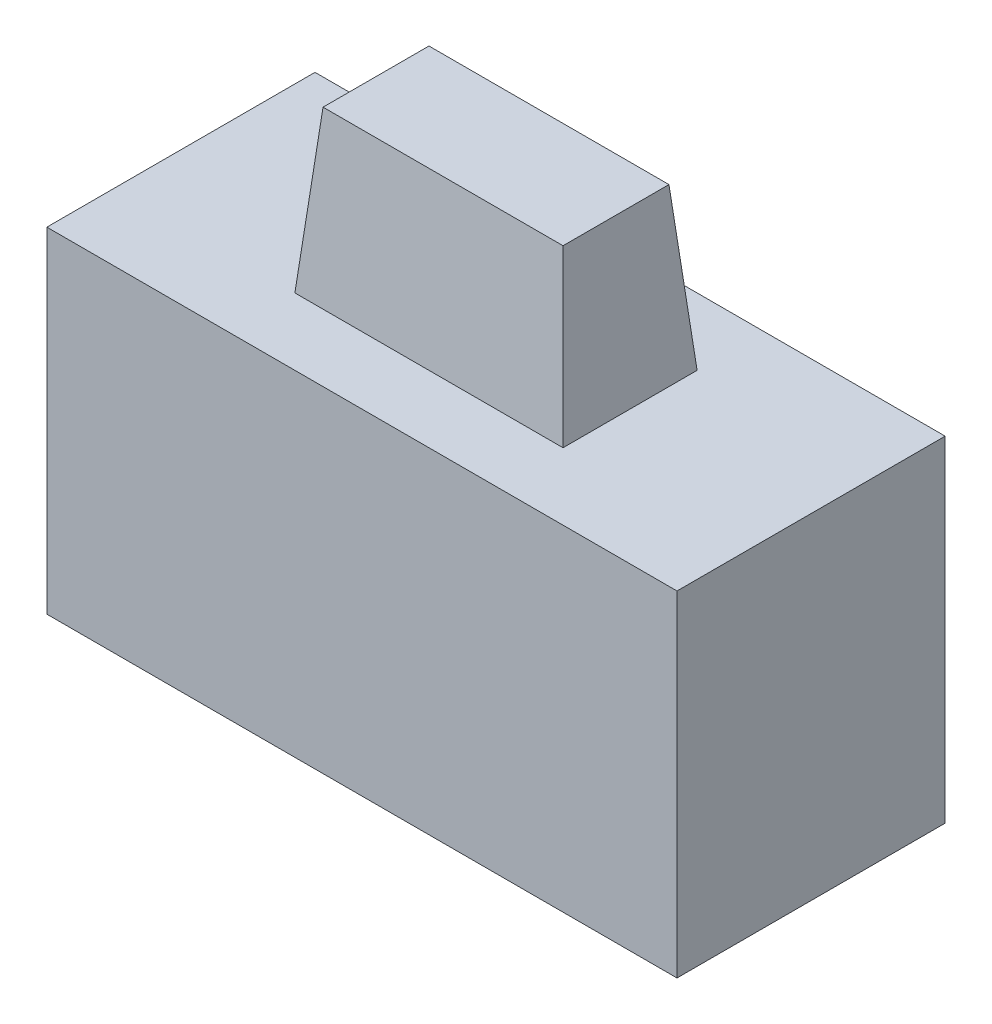
ISO-10303-21;
HEADER;
FILE_DESCRIPTION(('STEP AP214'),'2;1');
FILE_NAME('part.step','',(''),(''),'','','');
FILE_SCHEMA(('AUTOMOTIVE_DESIGN { 1 0 10303 214 1 1 1 1 }'));
ENDSEC;
DATA;
#1=APPLICATION_CONTEXT('core data for automotive mechanical design processes');
#2=APPLICATION_PROTOCOL_DEFINITION('international standard','automotive_design',2000,#1);
#3=PRODUCT_CONTEXT('',#1,'mechanical');
#4=PRODUCT('Part','Part','',(#3));
#5=PRODUCT_RELATED_PRODUCT_CATEGORY('part','',(#4));
#6=PRODUCT_DEFINITION_FORMATION('','',#4);
#7=PRODUCT_DEFINITION_CONTEXT('part definition',#1,'design');
#8=PRODUCT_DEFINITION('design','',#6,#7);
#9=PRODUCT_DEFINITION_SHAPE('','',#8);
#10=(LENGTH_UNIT() NAMED_UNIT(*) SI_UNIT(.MILLI.,.METRE.));
#11=(NAMED_UNIT(*) PLANE_ANGLE_UNIT() SI_UNIT($,.RADIAN.));
#12=(NAMED_UNIT(*) SI_UNIT($,.STERADIAN.) SOLID_ANGLE_UNIT());
#13=UNCERTAINTY_MEASURE_WITH_UNIT(LENGTH_MEASURE(1.E-05),#10,'distance_accuracy_value','');
#14=(GEOMETRIC_REPRESENTATION_CONTEXT(3) GLOBAL_UNCERTAINTY_ASSIGNED_CONTEXT((#13)) GLOBAL_UNIT_ASSIGNED_CONTEXT((#10,
#11,#12)) REPRESENTATION_CONTEXT('',''));
#15=CARTESIAN_POINT('',(0.,0.,0.));
#16=DIRECTION('',(0.,0.,1.));
#17=DIRECTION('',(1.,0.,0.));
#18=AXIS2_PLACEMENT_3D('',#15,#16,#17);
#19=CARTESIAN_POINT('',(-2.35,0.,2.));
#20=DIRECTION('',(0.,-1.,0.));
#21=DIRECTION('',(0.,0.,-1.));
#22=AXIS2_PLACEMENT_3D('',#19,#20,#21);
#23=PLANE('',#22);
#24=DIRECTION('',(-1.,0.,0.));
#25=VECTOR('',#24,1.);
#26=CARTESIAN_POINT('',(-2.35,0.,0.));
#27=LINE('',#26,#25);
#28=CARTESIAN_POINT('',(2.35,0.,0.));
#29=VERTEX_POINT('',#28);
#30=CARTESIAN_POINT('',(-2.35,0.,0.));
#31=VERTEX_POINT('',#30);
#32=EDGE_CURVE('E131',#29,#31,#27,.T.);
#33=ORIENTED_EDGE('',*,*,#32,.T.);
#34=DIRECTION('',(0.,0.,-1.));
#35=VECTOR('',#34,1.);
#36=CARTESIAN_POINT('',(-2.35,0.,2.));
#37=LINE('',#36,#35);
#38=CARTESIAN_POINT('',(-2.35,0.,2.));
#39=VERTEX_POINT('',#38);
#40=EDGE_CURVE('E137',#39,#31,#37,.T.);
#41=ORIENTED_EDGE('',*,*,#40,.F.);
#42=DIRECTION('',(-1.,0.,0.));
#43=VECTOR('',#42,1.);
#44=CARTESIAN_POINT('',(-2.35,0.,2.));
#45=LINE('',#44,#43);
#46=CARTESIAN_POINT('',(2.35,0.,2.));
#47=VERTEX_POINT('',#46);
#48=EDGE_CURVE('E135',#47,#39,#45,.T.);
#49=ORIENTED_EDGE('',*,*,#48,.F.);
#50=DIRECTION('',(0.,0.,-1.));
#51=VECTOR('',#50,1.);
#52=CARTESIAN_POINT('',(2.35,0.,2.));
#53=LINE('',#52,#51);
#54=EDGE_CURVE('E147',#47,#29,#53,.T.);
#55=ORIENTED_EDGE('',*,*,#54,.T.);
#56=EDGE_LOOP('',(#33,#41,#49,#55));
#57=FACE_BOUND('',#56,.T.);
#58=DIRECTION('',(0.,0.,-1.));
#59=VECTOR('',#58,1.);
#60=CARTESIAN_POINT('',(1.,0.,0.5));
#61=LINE('',#60,#59);
#62=CARTESIAN_POINT('',(1.,0.,1.5));
#63=VERTEX_POINT('',#62);
#64=CARTESIAN_POINT('',(1.,0.,0.5));
#65=VERTEX_POINT('',#64);
#66=EDGE_CURVE('E47',#63,#65,#61,.T.);
#67=ORIENTED_EDGE('',*,*,#66,.F.);
#68=DIRECTION('',(1.,0.,0.));
#69=VECTOR('',#68,1.);
#70=CARTESIAN_POINT('',(-1.,0.,1.5));
#71=LINE('',#70,#69);
#72=CARTESIAN_POINT('',(-1.,0.,1.5));
#73=VERTEX_POINT('',#72);
#74=EDGE_CURVE('E51',#73,#63,#71,.T.);
#75=ORIENTED_EDGE('',*,*,#74,.F.);
#76=DIRECTION('',(0.,0.,1.));
#77=VECTOR('',#76,1.);
#78=CARTESIAN_POINT('',(-1.,0.,0.5));
#79=LINE('',#78,#77);
#80=CARTESIAN_POINT('',(-1.,0.,0.5));
#81=VERTEX_POINT('',#80);
#82=EDGE_CURVE('E92',#81,#73,#79,.T.);
#83=ORIENTED_EDGE('',*,*,#82,.F.);
#84=DIRECTION('',(-1.,0.,0.));
#85=VECTOR('',#84,1.);
#86=CARTESIAN_POINT('',(-1.,0.,0.5));
#87=LINE('',#86,#85);
#88=EDGE_CURVE('E94',#65,#81,#87,.T.);
#89=ORIENTED_EDGE('',*,*,#88,.F.);
#90=EDGE_LOOP('',(#67,#75,#83,#89));
#91=FACE_BOUND('',#90,.T.);
#92=ADVANCED_FACE('F32',(#57,#91),#23,.F.);
#93=CARTESIAN_POINT('',(-2.35,0.,2.));
#94=DIRECTION('',(1.,0.,0.));
#95=DIRECTION('',(0.,1.,0.));
#96=AXIS2_PLACEMENT_3D('',#93,#94,#95);
#97=PLANE('',#96);
#98=DIRECTION('',(0.,-1.,0.));
#99=VECTOR('',#98,1.);
#100=CARTESIAN_POINT('',(-2.35,0.,0.));
#101=LINE('',#100,#99);
#102=CARTESIAN_POINT('',(-2.35,-2.5,0.));
#103=VERTEX_POINT('',#102);
#104=EDGE_CURVE('E113',#31,#103,#101,.T.);
#105=ORIENTED_EDGE('',*,*,#104,.T.);
#106=DIRECTION('',(0.,0.,-1.));
#107=VECTOR('',#106,1.);
#108=CARTESIAN_POINT('',(-2.35,-2.5,2.));
#109=LINE('',#108,#107);
#110=CARTESIAN_POINT('',(-2.35,-2.5,2.));
#111=VERTEX_POINT('',#110);
#112=EDGE_CURVE('E11',#111,#103,#109,.T.);
#113=ORIENTED_EDGE('',*,*,#112,.F.);
#114=DIRECTION('',(0.,-1.,0.));
#115=VECTOR('',#114,1.);
#116=CARTESIAN_POINT('',(-2.35,0.,2.));
#117=LINE('',#116,#115);
#118=EDGE_CURVE('E127',#39,#111,#117,.T.);
#119=ORIENTED_EDGE('',*,*,#118,.F.);
#120=ORIENTED_EDGE('',*,*,#40,.T.);
#121=EDGE_LOOP('',(#105,#113,#119,#120));
#122=FACE_BOUND('',#121,.T.);
#123=ADVANCED_FACE('F34',(#122),#97,.F.);
#124=CARTESIAN_POINT('',(-2.35,-2.5,2.));
#125=DIRECTION('',(0.,1.,0.));
#126=DIRECTION('',(0.,0.,1.));
#127=AXIS2_PLACEMENT_3D('',#124,#125,#126);
#128=PLANE('',#127);
#129=DIRECTION('',(1.,0.,0.));
#130=VECTOR('',#129,1.);
#131=CARTESIAN_POINT('',(-2.35,-2.5,0.));
#132=LINE('',#131,#130);
#133=CARTESIAN_POINT('',(2.35,-2.5,0.));
#134=VERTEX_POINT('',#133);
#135=EDGE_CURVE('E140',#103,#134,#132,.T.);
#136=ORIENTED_EDGE('',*,*,#135,.T.);
#137=DIRECTION('',(0.,0.,-1.));
#138=VECTOR('',#137,1.);
#139=CARTESIAN_POINT('',(2.35,-2.5,2.));
#140=LINE('',#139,#138);
#141=CARTESIAN_POINT('',(2.35,-2.5,2.));
#142=VERTEX_POINT('',#141);
#143=EDGE_CURVE('E40',#142,#134,#140,.T.);
#144=ORIENTED_EDGE('',*,*,#143,.F.);
#145=DIRECTION('',(1.,0.,0.));
#146=VECTOR('',#145,1.);
#147=CARTESIAN_POINT('',(-2.35,-2.5,2.));
#148=LINE('',#147,#146);
#149=EDGE_CURVE('E130',#111,#142,#148,.T.);
#150=ORIENTED_EDGE('',*,*,#149,.F.);
#151=ORIENTED_EDGE('',*,*,#112,.T.);
#152=EDGE_LOOP('',(#136,#144,#150,#151));
#153=FACE_BOUND('',#152,.T.);
#154=ADVANCED_FACE('F169',(#153),#128,.F.);
#155=CARTESIAN_POINT('',(2.35,0.,2.));
#156=DIRECTION('',(-1.,0.,0.));
#157=DIRECTION('',(0.,-1.,0.));
#158=AXIS2_PLACEMENT_3D('',#155,#156,#157);
#159=PLANE('',#158);
#160=DIRECTION('',(0.,1.,0.));
#161=VECTOR('',#160,1.);
#162=CARTESIAN_POINT('',(2.35,0.,0.));
#163=LINE('',#162,#161);
#164=EDGE_CURVE('E142',#134,#29,#163,.T.);
#165=ORIENTED_EDGE('',*,*,#164,.T.);
#166=ORIENTED_EDGE('',*,*,#54,.F.);
#167=DIRECTION('',(0.,1.,0.));
#168=VECTOR('',#167,1.);
#169=CARTESIAN_POINT('',(2.35,0.,2.));
#170=LINE('',#169,#168);
#171=EDGE_CURVE('E133',#142,#47,#170,.T.);
#172=ORIENTED_EDGE('',*,*,#171,.F.);
#173=ORIENTED_EDGE('',*,*,#143,.T.);
#174=EDGE_LOOP('',(#165,#166,#172,#173));
#175=FACE_BOUND('',#174,.T.);
#176=ADVANCED_FACE('F154',(#175),#159,.F.);
#177=CARTESIAN_POINT('',(0.,0.,2.));
#178=DIRECTION('',(0.,0.,1.));
#179=DIRECTION('',(1.,0.,0.));
#180=AXIS2_PLACEMENT_3D('',#177,#178,#179);
#181=PLANE('',#180);
#182=ORIENTED_EDGE('',*,*,#118,.T.);
#183=ORIENTED_EDGE('',*,*,#149,.T.);
#184=ORIENTED_EDGE('',*,*,#171,.T.);
#185=ORIENTED_EDGE('',*,*,#48,.T.);
#186=EDGE_LOOP('',(#182,#183,#184,#185));
#187=FACE_BOUND('',#186,.T.);
#188=ADVANCED_FACE('F168',(#187),#181,.T.);
#189=CARTESIAN_POINT('',(0.,0.,0.));
#190=DIRECTION('',(0.,0.,1.));
#191=DIRECTION('',(1.,0.,0.));
#192=AXIS2_PLACEMENT_3D('',#189,#190,#191);
#193=PLANE('',#192);
#194=ORIENTED_EDGE('',*,*,#104,.F.);
#195=ORIENTED_EDGE('',*,*,#32,.F.);
#196=ORIENTED_EDGE('',*,*,#164,.F.);
#197=ORIENTED_EDGE('',*,*,#135,.F.);
#198=EDGE_LOOP('',(#194,#195,#196,#197));
#199=FACE_BOUND('',#198,.T.);
#200=ADVANCED_FACE('F160',(#199),#193,.F.);
#201=CARTESIAN_POINT('',(1.,0.,0.5));
#202=DIRECTION('',(0.996194698091746,0.0871557427476582,0.));
#203=DIRECTION('',(-0.0871557427476582,0.996194698091746,0.));
#204=AXIS2_PLACEMENT_3D('',#201,#202,#203);
#205=PLANE('',#204);
#206=ORIENTED_EDGE('',*,*,#66,.T.);
#207=DIRECTION('',(0.0868265938642476,-0.992432509138967,-0.0868265938642476));
#208=VECTOR('',#207,1.);
#209=CARTESIAN_POINT('',(0.984922285195866,0.172339068817371,0.515077714804134));
#210=LINE('',#209,#208);
#211=CARTESIAN_POINT('',(0.895013603768891,1.2,0.604986396231109));
#212=VERTEX_POINT('',#211);
#213=EDGE_CURVE('E107',#212,#65,#210,.T.);
#214=ORIENTED_EDGE('',*,*,#213,.F.);
#215=DIRECTION('',(0.,0.,1.));
#216=VECTOR('',#215,1.);
#217=CARTESIAN_POINT('',(0.895013603768891,1.2,0.5));
#218=LINE('',#217,#216);
#219=CARTESIAN_POINT('',(0.895013603768892,1.2,1.39501360376889));
#220=VERTEX_POINT('',#219);
#221=EDGE_CURVE('E119',#220,#212,#218,.F.);
#222=ORIENTED_EDGE('',*,*,#221,.F.);
#223=DIRECTION('',(0.0868265938642477,-0.992432509138967,0.0868265938642476));
#224=VECTOR('',#223,1.);
#225=CARTESIAN_POINT('',(0.992461142597933,0.0861695344086854,1.49246114259793));
#226=LINE('',#225,#224);
#227=EDGE_CURVE('E115',#220,#63,#226,.T.);
#228=ORIENTED_EDGE('',*,*,#227,.T.);
#229=EDGE_LOOP('',(#206,#214,#222,#228));
#230=FACE_BOUND('',#229,.T.);
#231=ADVANCED_FACE('F183',(#230),#205,.T.);
#232=CARTESIAN_POINT('',(-1.,0.,0.5));
#233=DIRECTION('',(0.,0.0871557427476582,-0.996194698091746));
#234=DIRECTION('',(0.,0.996194698091746,0.0871557427476582));
#235=AXIS2_PLACEMENT_3D('',#232,#233,#234);
#236=PLANE('',#235);
#237=ORIENTED_EDGE('',*,*,#88,.T.);
#238=DIRECTION('',(-0.0868265938642477,-0.992432509138967,-0.0868265938642476));
#239=VECTOR('',#238,1.);
#240=CARTESIAN_POINT('',(-1.,0.,0.5));
#241=LINE('',#240,#239);
#242=CARTESIAN_POINT('',(-0.895013603768891,1.2,0.604986396231109));
#243=VERTEX_POINT('',#242);
#244=EDGE_CURVE('E104',#243,#81,#241,.T.);
#245=ORIENTED_EDGE('',*,*,#244,.F.);
#246=DIRECTION('',(1.,0.,0.));
#247=VECTOR('',#246,1.);
#248=CARTESIAN_POINT('',(-1.,1.2,0.604986396231109));
#249=LINE('',#248,#247);
#250=EDGE_CURVE('E122',#212,#243,#249,.F.);
#251=ORIENTED_EDGE('',*,*,#250,.F.);
#252=ORIENTED_EDGE('',*,*,#213,.T.);
#253=EDGE_LOOP('',(#237,#245,#251,#252));
#254=FACE_BOUND('',#253,.T.);
#255=ADVANCED_FACE('F103',(#254),#236,.T.);
#256=CARTESIAN_POINT('',(-1.,0.,0.5));
#257=DIRECTION('',(-0.996194698091746,0.0871557427476582,0.));
#258=DIRECTION('',(-0.0871557427476582,-0.996194698091746,0.));
#259=AXIS2_PLACEMENT_3D('',#256,#257,#258);
#260=PLANE('',#259);
#261=ORIENTED_EDGE('',*,*,#82,.T.);
#262=DIRECTION('',(-0.0868265938642476,-0.992432509138967,0.0868265938642476));
#263=VECTOR('',#262,1.);
#264=CARTESIAN_POINT('',(-1.,0.,1.5));
#265=LINE('',#264,#263);
#266=CARTESIAN_POINT('',(-0.895013603768891,1.2,1.39501360376889));
#267=VERTEX_POINT('',#266);
#268=EDGE_CURVE('E111',#267,#73,#265,.T.);
#269=ORIENTED_EDGE('',*,*,#268,.F.);
#270=DIRECTION('',(0.,0.,-1.));
#271=VECTOR('',#270,1.);
#272=CARTESIAN_POINT('',(-0.895013603768891,1.2,0.5));
#273=LINE('',#272,#271);
#274=EDGE_CURVE('E110',#243,#267,#273,.F.);
#275=ORIENTED_EDGE('',*,*,#274,.F.);
#276=ORIENTED_EDGE('',*,*,#244,.T.);
#277=EDGE_LOOP('',(#261,#269,#275,#276));
#278=FACE_BOUND('',#277,.T.);
#279=ADVANCED_FACE('F109',(#278),#260,.T.);
#280=CARTESIAN_POINT('',(-1.,0.,1.5));
#281=DIRECTION('',(0.,0.0871557427476582,0.996194698091746));
#282=DIRECTION('',(0.,-0.996194698091746,0.0871557427476582));
#283=AXIS2_PLACEMENT_3D('',#280,#281,#282);
#284=PLANE('',#283);
#285=ORIENTED_EDGE('',*,*,#74,.T.);
#286=ORIENTED_EDGE('',*,*,#227,.F.);
#287=DIRECTION('',(-1.,0.,0.));
#288=VECTOR('',#287,1.);
#289=CARTESIAN_POINT('',(-1.,1.2,1.39501360376889));
#290=LINE('',#289,#288);
#291=EDGE_CURVE('E125',#267,#220,#290,.F.);
#292=ORIENTED_EDGE('',*,*,#291,.F.);
#293=ORIENTED_EDGE('',*,*,#268,.T.);
#294=EDGE_LOOP('',(#285,#286,#292,#293));
#295=FACE_BOUND('',#294,.T.);
#296=ADVANCED_FACE('F190',(#295),#284,.T.);
#297=CARTESIAN_POINT('',(0.,1.2,0.));
#298=DIRECTION('',(0.,1.,0.));
#299=DIRECTION('',(0.,0.,1.));
#300=AXIS2_PLACEMENT_3D('',#297,#298,#299);
#301=PLANE('',#300);
#302=ORIENTED_EDGE('',*,*,#221,.T.);
#303=ORIENTED_EDGE('',*,*,#250,.T.);
#304=ORIENTED_EDGE('',*,*,#274,.T.);
#305=ORIENTED_EDGE('',*,*,#291,.T.);
#306=EDGE_LOOP('',(#302,#303,#304,#305));
#307=FACE_BOUND('',#306,.T.);
#308=ADVANCED_FACE('F193',(#307),#301,.T.);
#309=CLOSED_SHELL('',(#92,#123,#154,#176,#188,#200,#231,#255,#279,#296,#308));
#310=MANIFOLD_SOLID_BREP('B2',#309);
#311=ADVANCED_BREP_SHAPE_REPRESENTATION('',(#18,#310),#14);
#312=SHAPE_DEFINITION_REPRESENTATION(#9,#311);
ENDSEC;
END-ISO-10303-21;
